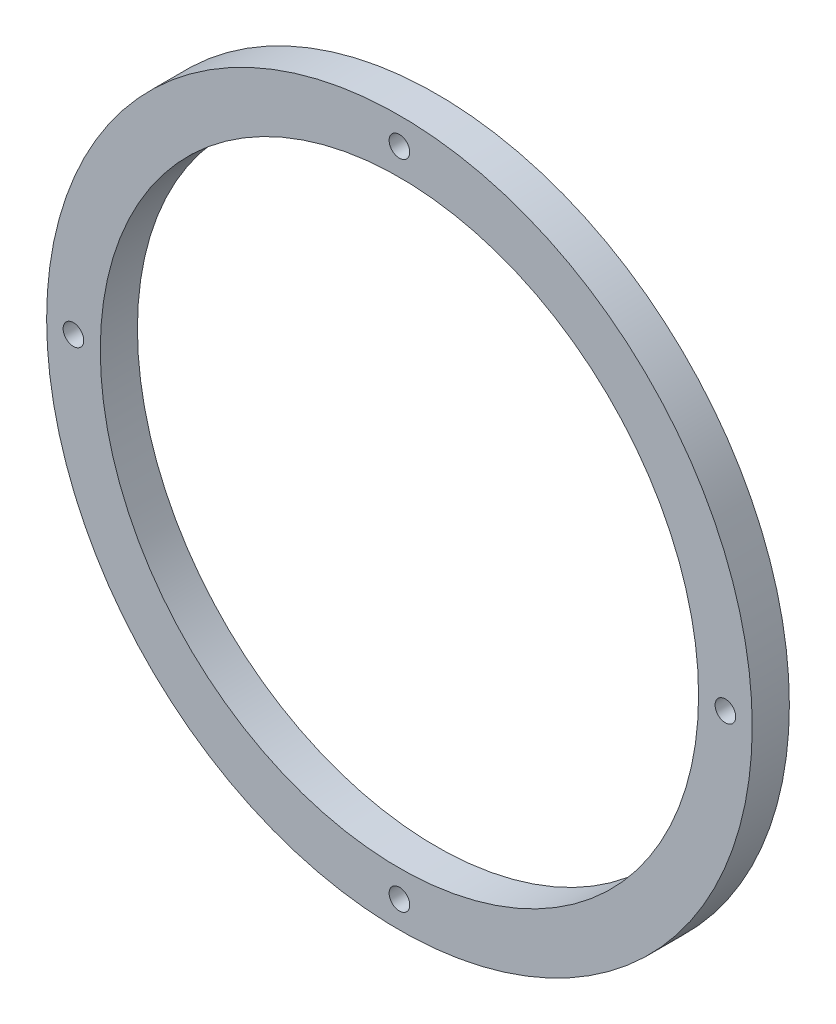
ISO-10303-21;
HEADER;
FILE_DESCRIPTION(('STEP AP214'),'2;1');
FILE_NAME('part.step','',(''),(''),'','','');
FILE_SCHEMA(('AUTOMOTIVE_DESIGN { 1 0 10303 214 1 1 1 1 }'));
ENDSEC;
DATA;
#1=APPLICATION_CONTEXT('core data for automotive mechanical design processes');
#2=APPLICATION_PROTOCOL_DEFINITION('international standard','automotive_design',2000,#1);
#3=PRODUCT_CONTEXT('',#1,'mechanical');
#4=PRODUCT('Part','Part','',(#3));
#5=PRODUCT_RELATED_PRODUCT_CATEGORY('part','',(#4));
#6=PRODUCT_DEFINITION_FORMATION('','',#4);
#7=PRODUCT_DEFINITION_CONTEXT('part definition',#1,'design');
#8=PRODUCT_DEFINITION('design','',#6,#7);
#9=PRODUCT_DEFINITION_SHAPE('','',#8);
#10=(LENGTH_UNIT() NAMED_UNIT(*) SI_UNIT(.MILLI.,.METRE.));
#11=(NAMED_UNIT(*) PLANE_ANGLE_UNIT() SI_UNIT($,.RADIAN.));
#12=(NAMED_UNIT(*) SI_UNIT($,.STERADIAN.) SOLID_ANGLE_UNIT());
#13=UNCERTAINTY_MEASURE_WITH_UNIT(LENGTH_MEASURE(1.E-05),#10,'distance_accuracy_value','');
#14=(GEOMETRIC_REPRESENTATION_CONTEXT(3) GLOBAL_UNCERTAINTY_ASSIGNED_CONTEXT((#13)) GLOBAL_UNIT_ASSIGNED_CONTEXT((#10,
#11,#12)) REPRESENTATION_CONTEXT('',''));
#15=CARTESIAN_POINT('',(0.,0.,0.));
#16=DIRECTION('',(0.,0.,1.));
#17=DIRECTION('',(1.,0.,0.));
#18=AXIS2_PLACEMENT_3D('',#15,#16,#17);
#19=CARTESIAN_POINT('',(0.,0.,9.));
#20=DIRECTION('',(0.,0.,1.));
#21=DIRECTION('',(1.,0.,0.));
#22=AXIS2_PLACEMENT_3D('',#19,#20,#21);
#23=PLANE('',#22);
#24=CARTESIAN_POINT('',(0.,79.,9.));
#25=DIRECTION('',(0.,0.,1.));
#26=DIRECTION('',(1.,0.,0.));
#27=AXIS2_PLACEMENT_3D('',#24,#25,#26);
#28=CIRCLE('',#27,2.5);
#29=CARTESIAN_POINT('',(2.5,79.,9.));
#30=VERTEX_POINT('',#29);
#31=EDGE_CURVE('E70',#30,#30,#28,.T.);
#32=ORIENTED_EDGE('',*,*,#31,.F.);
#33=EDGE_LOOP('',(#32));
#34=FACE_BOUND('',#33,.T.);
#35=CARTESIAN_POINT('',(79.0000000000022,2.23096206694533E-12,9.));
#36=DIRECTION('',(0.,0.,1.));
#37=DIRECTION('',(1.,0.,0.));
#38=AXIS2_PLACEMENT_3D('',#35,#36,#37);
#39=CIRCLE('',#38,2.50000000000174);
#40=CARTESIAN_POINT('',(81.500000000004,2.23096206694533E-12,9.));
#41=VERTEX_POINT('',#40);
#42=EDGE_CURVE('E64',#41,#41,#39,.T.);
#43=ORIENTED_EDGE('',*,*,#42,.F.);
#44=EDGE_LOOP('',(#43));
#45=FACE_BOUND('',#44,.T.);
#46=CARTESIAN_POINT('',(4.46192413389066E-12,-79.,9.));
#47=DIRECTION('',(0.,0.,1.));
#48=DIRECTION('',(1.,0.,0.));
#49=AXIS2_PLACEMENT_3D('',#46,#47,#48);
#50=CIRCLE('',#49,2.5000000000048);
#51=CARTESIAN_POINT('',(2.50000000000926,-79.,9.));
#52=VERTEX_POINT('',#51);
#53=EDGE_CURVE('E58',#52,#52,#50,.T.);
#54=ORIENTED_EDGE('',*,*,#53,.F.);
#55=EDGE_LOOP('',(#54));
#56=FACE_BOUND('',#55,.T.);
#57=CARTESIAN_POINT('',(-78.9999999999978,-2.24063677665859E-12,9.));
#58=DIRECTION('',(0.,0.,1.));
#59=DIRECTION('',(1.,0.,0.));
#60=AXIS2_PLACEMENT_3D('',#57,#58,#59);
#61=CIRCLE('',#60,2.50000000000359);
#62=CARTESIAN_POINT('',(-76.4999999999942,-2.24063677665859E-12,9.));
#63=VERTEX_POINT('',#62);
#64=EDGE_CURVE('E52',#63,#63,#61,.T.);
#65=ORIENTED_EDGE('',*,*,#64,.F.);
#66=EDGE_LOOP('',(#65));
#67=FACE_BOUND('',#66,.T.);
#68=CARTESIAN_POINT('',(0.,0.,9.));
#69=DIRECTION('',(0.,0.,1.));
#70=DIRECTION('',(1.,0.,0.));
#71=AXIS2_PLACEMENT_3D('',#68,#69,#70);
#72=CIRCLE('',#71,85.5);
#73=CARTESIAN_POINT('',(85.5,0.,9.));
#74=VERTEX_POINT('',#73);
#75=EDGE_CURVE('E10',#74,#74,#72,.T.);
#76=ORIENTED_EDGE('',*,*,#75,.T.);
#77=EDGE_LOOP('',(#76));
#78=FACE_BOUND('',#77,.T.);
#79=CARTESIAN_POINT('',(0.,0.,9.));
#80=DIRECTION('',(0.,0.,1.));
#81=DIRECTION('',(1.,0.,0.));
#82=AXIS2_PLACEMENT_3D('',#79,#80,#81);
#83=CIRCLE('',#82,72.5);
#84=CARTESIAN_POINT('',(72.5,0.,9.));
#85=VERTEX_POINT('',#84);
#86=EDGE_CURVE('E44',#85,#85,#83,.T.);
#87=ORIENTED_EDGE('',*,*,#86,.F.);
#88=EDGE_LOOP('',(#87));
#89=FACE_BOUND('',#88,.T.);
#90=ADVANCED_FACE('F33',(#34,#45,#56,#67,#78,#89),#23,.T.);
#91=CARTESIAN_POINT('',(0.,0.,0.));
#92=DIRECTION('',(0.,0.,1.));
#93=DIRECTION('',(1.,0.,0.));
#94=AXIS2_PLACEMENT_3D('',#91,#92,#93);
#95=PLANE('',#94);
#96=CARTESIAN_POINT('',(0.,79.,0.));
#97=DIRECTION('',(0.,0.,1.));
#98=DIRECTION('',(1.,0.,0.));
#99=AXIS2_PLACEMENT_3D('',#96,#97,#98);
#100=CIRCLE('',#99,2.5);
#101=CARTESIAN_POINT('',(2.5,79.,0.));
#102=VERTEX_POINT('',#101);
#103=EDGE_CURVE('E49',#102,#102,#100,.T.);
#104=ORIENTED_EDGE('',*,*,#103,.T.);
#105=EDGE_LOOP('',(#104));
#106=FACE_BOUND('',#105,.T.);
#107=CARTESIAN_POINT('',(79.0000000000022,2.23096206694533E-12,0.));
#108=DIRECTION('',(0.,0.,1.));
#109=DIRECTION('',(1.,0.,0.));
#110=AXIS2_PLACEMENT_3D('',#107,#108,#109);
#111=CIRCLE('',#110,2.50000000000174);
#112=CARTESIAN_POINT('',(81.500000000004,2.23096206694533E-12,0.));
#113=VERTEX_POINT('',#112);
#114=EDGE_CURVE('E67',#113,#113,#111,.T.);
#115=ORIENTED_EDGE('',*,*,#114,.T.);
#116=EDGE_LOOP('',(#115));
#117=FACE_BOUND('',#116,.T.);
#118=CARTESIAN_POINT('',(4.46192413389066E-12,-79.,0.));
#119=DIRECTION('',(0.,0.,1.));
#120=DIRECTION('',(1.,0.,0.));
#121=AXIS2_PLACEMENT_3D('',#118,#119,#120);
#122=CIRCLE('',#121,2.5000000000048);
#123=CARTESIAN_POINT('',(2.50000000000926,-79.,0.));
#124=VERTEX_POINT('',#123);
#125=EDGE_CURVE('E61',#124,#124,#122,.T.);
#126=ORIENTED_EDGE('',*,*,#125,.T.);
#127=EDGE_LOOP('',(#126));
#128=FACE_BOUND('',#127,.T.);
#129=CARTESIAN_POINT('',(-78.9999999999978,-2.24063677665859E-12,0.));
#130=DIRECTION('',(0.,0.,1.));
#131=DIRECTION('',(1.,0.,0.));
#132=AXIS2_PLACEMENT_3D('',#129,#130,#131);
#133=CIRCLE('',#132,2.50000000000359);
#134=CARTESIAN_POINT('',(-76.4999999999942,-2.24063677665859E-12,0.));
#135=VERTEX_POINT('',#134);
#136=EDGE_CURVE('E55',#135,#135,#133,.T.);
#137=ORIENTED_EDGE('',*,*,#136,.T.);
#138=EDGE_LOOP('',(#137));
#139=FACE_BOUND('',#138,.T.);
#140=CARTESIAN_POINT('',(0.,0.,0.));
#141=DIRECTION('',(0.,0.,1.));
#142=DIRECTION('',(1.,0.,0.));
#143=AXIS2_PLACEMENT_3D('',#140,#141,#142);
#144=CIRCLE('',#143,85.5);
#145=CARTESIAN_POINT('',(85.5,0.,0.));
#146=VERTEX_POINT('',#145);
#147=EDGE_CURVE('E37',#146,#146,#144,.T.);
#148=ORIENTED_EDGE('',*,*,#147,.F.);
#149=EDGE_LOOP('',(#148));
#150=FACE_BOUND('',#149,.T.);
#151=CARTESIAN_POINT('',(0.,0.,0.));
#152=DIRECTION('',(0.,0.,1.));
#153=DIRECTION('',(1.,0.,0.));
#154=AXIS2_PLACEMENT_3D('',#151,#152,#153);
#155=CIRCLE('',#154,72.5);
#156=CARTESIAN_POINT('',(72.5,0.,0.));
#157=VERTEX_POINT('',#156);
#158=EDGE_CURVE('E46',#157,#157,#155,.T.);
#159=ORIENTED_EDGE('',*,*,#158,.T.);
#160=EDGE_LOOP('',(#159));
#161=FACE_BOUND('',#160,.T.);
#162=ADVANCED_FACE('F76',(#106,#117,#128,#139,#150,#161),#95,.F.);
#163=CARTESIAN_POINT('',(0.,0.,9.));
#164=DIRECTION('',(0.,0.,-1.));
#165=DIRECTION('',(-1.,0.,0.));
#166=AXIS2_PLACEMENT_3D('',#163,#164,#165);
#167=CYLINDRICAL_SURFACE('',#166,85.5);
#168=ORIENTED_EDGE('',*,*,#75,.F.);
#169=EDGE_LOOP('',(#168));
#170=FACE_BOUND('',#169,.T.);
#171=ORIENTED_EDGE('',*,*,#147,.T.);
#172=EDGE_LOOP('',(#171));
#173=FACE_BOUND('',#172,.T.);
#174=ADVANCED_FACE('F35',(#170,#173),#167,.T.);
#175=CARTESIAN_POINT('',(0.,0.,9.));
#176=DIRECTION('',(0.,0.,-1.));
#177=DIRECTION('',(-1.,0.,0.));
#178=AXIS2_PLACEMENT_3D('',#175,#176,#177);
#179=CYLINDRICAL_SURFACE('',#178,72.5);
#180=ORIENTED_EDGE('',*,*,#86,.T.);
#181=EDGE_LOOP('',(#180));
#182=FACE_BOUND('',#181,.T.);
#183=ORIENTED_EDGE('',*,*,#158,.F.);
#184=EDGE_LOOP('',(#183));
#185=FACE_BOUND('',#184,.T.);
#186=ADVANCED_FACE('F97',(#182,#185),#179,.F.);
#187=CARTESIAN_POINT('',(-78.9999999999978,-2.24063677665859E-12,0.));
#188=DIRECTION('',(0.,0.,1.));
#189=DIRECTION('',(1.,0.,0.));
#190=AXIS2_PLACEMENT_3D('',#187,#188,#189);
#191=CYLINDRICAL_SURFACE('',#190,2.50000000000359);
#192=ORIENTED_EDGE('',*,*,#136,.F.);
#193=EDGE_LOOP('',(#192));
#194=FACE_BOUND('',#193,.T.);
#195=ORIENTED_EDGE('',*,*,#64,.T.);
#196=EDGE_LOOP('',(#195));
#197=FACE_BOUND('',#196,.T.);
#198=ADVANCED_FACE('F100',(#194,#197),#191,.F.);
#199=CARTESIAN_POINT('',(4.46192413389066E-12,-79.,0.));
#200=DIRECTION('',(0.,0.,1.));
#201=DIRECTION('',(1.,0.,0.));
#202=AXIS2_PLACEMENT_3D('',#199,#200,#201);
#203=CYLINDRICAL_SURFACE('',#202,2.5000000000048);
#204=ORIENTED_EDGE('',*,*,#125,.F.);
#205=EDGE_LOOP('',(#204));
#206=FACE_BOUND('',#205,.T.);
#207=ORIENTED_EDGE('',*,*,#53,.T.);
#208=EDGE_LOOP('',(#207));
#209=FACE_BOUND('',#208,.T.);
#210=ADVANCED_FACE('F113',(#206,#209),#203,.F.);
#211=CARTESIAN_POINT('',(79.0000000000022,2.23096206694533E-12,0.));
#212=DIRECTION('',(0.,0.,1.));
#213=DIRECTION('',(1.,0.,0.));
#214=AXIS2_PLACEMENT_3D('',#211,#212,#213);
#215=CYLINDRICAL_SURFACE('',#214,2.50000000000174);
#216=ORIENTED_EDGE('',*,*,#114,.F.);
#217=EDGE_LOOP('',(#216));
#218=FACE_BOUND('',#217,.T.);
#219=ORIENTED_EDGE('',*,*,#42,.T.);
#220=EDGE_LOOP('',(#219));
#221=FACE_BOUND('',#220,.T.);
#222=ADVANCED_FACE('F82',(#218,#221),#215,.F.);
#223=CARTESIAN_POINT('',(0.,79.,0.));
#224=DIRECTION('',(0.,0.,1.));
#225=DIRECTION('',(1.,0.,0.));
#226=AXIS2_PLACEMENT_3D('',#223,#224,#225);
#227=CYLINDRICAL_SURFACE('',#226,2.5);
#228=ORIENTED_EDGE('',*,*,#103,.F.);
#229=EDGE_LOOP('',(#228));
#230=FACE_BOUND('',#229,.T.);
#231=ORIENTED_EDGE('',*,*,#31,.T.);
#232=EDGE_LOOP('',(#231));
#233=FACE_BOUND('',#232,.T.);
#234=ADVANCED_FACE('F79',(#230,#233),#227,.F.);
#235=CLOSED_SHELL('',(#90,#162,#174,#186,#198,#210,#222,#234));
#236=MANIFOLD_SOLID_BREP('B2',#235);
#237=ADVANCED_BREP_SHAPE_REPRESENTATION('',(#18,#236),#14);
#238=SHAPE_DEFINITION_REPRESENTATION(#9,#237);
ENDSEC;
END-ISO-10303-21;
